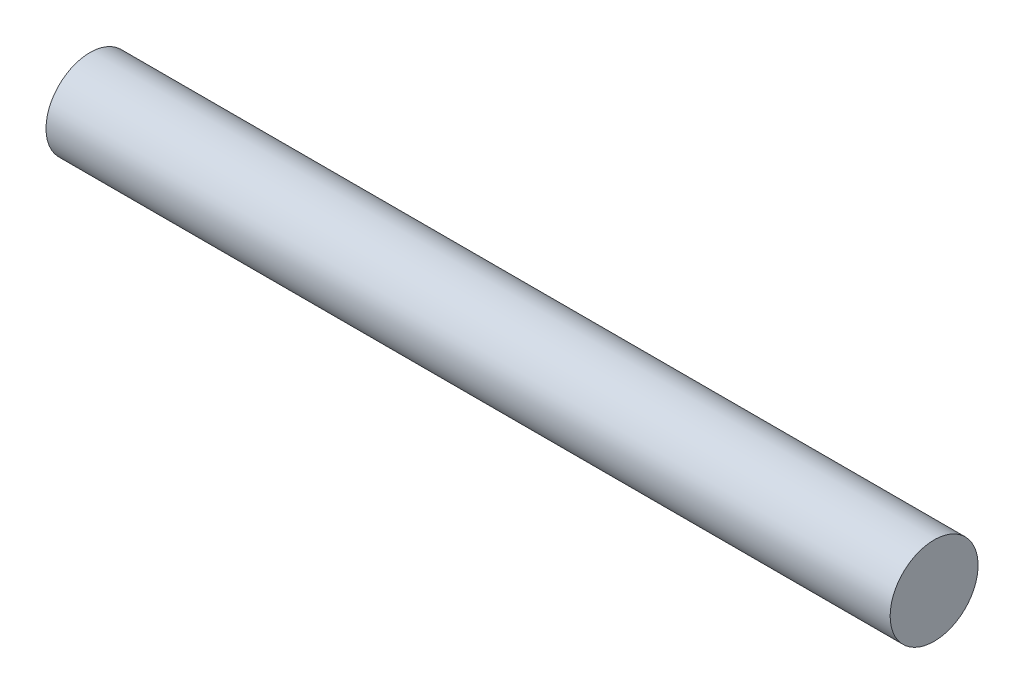
ISO-10303-21;
HEADER;
FILE_DESCRIPTION(('STEP AP214'),'2;1');
FILE_NAME('part.step','',(''),(''),'','','');
FILE_SCHEMA(('AUTOMOTIVE_DESIGN { 1 0 10303 214 1 1 1 1 }'));
ENDSEC;
DATA;
#1=APPLICATION_CONTEXT('core data for automotive mechanical design processes');
#2=APPLICATION_PROTOCOL_DEFINITION('international standard','automotive_design',2000,#1);
#3=PRODUCT_CONTEXT('',#1,'mechanical');
#4=PRODUCT('Part','Part','',(#3));
#5=PRODUCT_RELATED_PRODUCT_CATEGORY('part','',(#4));
#6=PRODUCT_DEFINITION_FORMATION('','',#4);
#7=PRODUCT_DEFINITION_CONTEXT('part definition',#1,'design');
#8=PRODUCT_DEFINITION('design','',#6,#7);
#9=PRODUCT_DEFINITION_SHAPE('','',#8);
#10=(LENGTH_UNIT() NAMED_UNIT(*) SI_UNIT(.MILLI.,.METRE.));
#11=(NAMED_UNIT(*) PLANE_ANGLE_UNIT() SI_UNIT($,.RADIAN.));
#12=(NAMED_UNIT(*) SI_UNIT($,.STERADIAN.) SOLID_ANGLE_UNIT());
#13=UNCERTAINTY_MEASURE_WITH_UNIT(LENGTH_MEASURE(1.E-05),#10,'distance_accuracy_value','');
#14=(GEOMETRIC_REPRESENTATION_CONTEXT(3) GLOBAL_UNCERTAINTY_ASSIGNED_CONTEXT((#13)) GLOBAL_UNIT_ASSIGNED_CONTEXT((#10,
#11,#12)) REPRESENTATION_CONTEXT('',''));
#15=CARTESIAN_POINT('',(0.,0.,0.));
#16=DIRECTION('',(0.,0.,1.));
#17=DIRECTION('',(1.,0.,0.));
#18=AXIS2_PLACEMENT_3D('',#15,#16,#17);
#19=CARTESIAN_POINT('',(76.2,0.,0.));
#20=DIRECTION('',(-1.,0.,0.));
#21=DIRECTION('',(0.,0.,1.));
#22=AXIS2_PLACEMENT_3D('',#19,#20,#21);
#23=CYLINDRICAL_SURFACE('',#22,15.875);
#24=CARTESIAN_POINT('',(0.,0.,0.));
#25=DIRECTION('',(1.,0.,0.));
#26=DIRECTION('',(0.,0.,-1.));
#27=AXIS2_PLACEMENT_3D('',#24,#25,#26);
#28=CIRCLE('',#27,15.875);
#29=CARTESIAN_POINT('',(0.,0.,15.875));
#30=VERTEX_POINT('',#29);
#31=EDGE_CURVE('E12',#30,#30,#28,.T.);
#32=CARTESIAN_POINT('',(304.8,0.,0.));
#33=DIRECTION('',(1.,0.,0.));
#34=DIRECTION('',(0.,0.,-1.));
#35=AXIS2_PLACEMENT_3D('',#32,#33,#34);
#36=CIRCLE('',#35,15.875);
#37=CARTESIAN_POINT('',(304.8,0.,15.875));
#38=VERTEX_POINT('',#37);
#39=EDGE_CURVE('E52',#38,#38,#36,.T.);
#40=CARTESIAN_POINT('',(0.,0.,15.875));
#41=CARTESIAN_POINT('',(3.175,0.,15.875));
#42=CARTESIAN_POINT('',(6.35,0.,15.875));
#43=CARTESIAN_POINT('',(12.7,0.,15.875));
#44=CARTESIAN_POINT('',(15.875,0.,15.875));
#45=CARTESIAN_POINT('',(22.225,0.,15.875));
#46=CARTESIAN_POINT('',(25.4,0.,15.875));
#47=CARTESIAN_POINT('',(31.75,0.,15.875));
#48=CARTESIAN_POINT('',(34.925,0.,15.875));
#49=CARTESIAN_POINT('',(41.275,0.,15.875));
#50=CARTESIAN_POINT('',(44.45,0.,15.875));
#51=CARTESIAN_POINT('',(50.8,0.,15.875));
#52=CARTESIAN_POINT('',(53.975,0.,15.875));
#53=CARTESIAN_POINT('',(60.325,0.,15.875));
#54=CARTESIAN_POINT('',(63.5,0.,15.875));
#55=CARTESIAN_POINT('',(69.85,0.,15.875));
#56=CARTESIAN_POINT('',(73.025,0.,15.875));
#57=CARTESIAN_POINT('',(79.375,0.,15.875));
#58=CARTESIAN_POINT('',(82.55,0.,15.875));
#59=CARTESIAN_POINT('',(88.9,0.,15.875));
#60=CARTESIAN_POINT('',(92.075,0.,15.875));
#61=CARTESIAN_POINT('',(98.425,0.,15.875));
#62=CARTESIAN_POINT('',(101.6,0.,15.875));
#63=CARTESIAN_POINT('',(107.95,0.,15.875));
#64=CARTESIAN_POINT('',(111.125,0.,15.875));
#65=CARTESIAN_POINT('',(117.475,0.,15.875));
#66=CARTESIAN_POINT('',(120.65,0.,15.875));
#67=CARTESIAN_POINT('',(127.,0.,15.875));
#68=CARTESIAN_POINT('',(130.175,0.,15.875));
#69=CARTESIAN_POINT('',(136.525,0.,15.875));
#70=CARTESIAN_POINT('',(139.7,0.,15.875));
#71=CARTESIAN_POINT('',(146.05,0.,15.875));
#72=CARTESIAN_POINT('',(149.225,0.,15.875));
#73=CARTESIAN_POINT('',(155.575,0.,15.875));
#74=CARTESIAN_POINT('',(158.75,0.,15.875));
#75=CARTESIAN_POINT('',(165.1,0.,15.875));
#76=CARTESIAN_POINT('',(168.275,0.,15.875));
#77=CARTESIAN_POINT('',(174.625,0.,15.875));
#78=CARTESIAN_POINT('',(177.8,0.,15.875));
#79=CARTESIAN_POINT('',(184.15,0.,15.875));
#80=CARTESIAN_POINT('',(187.325,0.,15.875));
#81=CARTESIAN_POINT('',(193.675,0.,15.875));
#82=CARTESIAN_POINT('',(196.85,0.,15.875));
#83=CARTESIAN_POINT('',(203.2,0.,15.875));
#84=CARTESIAN_POINT('',(206.375,0.,15.875));
#85=CARTESIAN_POINT('',(212.725,0.,15.875));
#86=CARTESIAN_POINT('',(215.9,0.,15.875));
#87=CARTESIAN_POINT('',(222.25,0.,15.875));
#88=CARTESIAN_POINT('',(225.425,0.,15.875));
#89=CARTESIAN_POINT('',(231.775,0.,15.875));
#90=CARTESIAN_POINT('',(234.95,0.,15.875));
#91=CARTESIAN_POINT('',(241.3,0.,15.875));
#92=CARTESIAN_POINT('',(244.475,0.,15.875));
#93=CARTESIAN_POINT('',(250.825,0.,15.875));
#94=CARTESIAN_POINT('',(254.,0.,15.875));
#95=CARTESIAN_POINT('',(260.35,0.,15.875));
#96=CARTESIAN_POINT('',(263.525,0.,15.875));
#97=CARTESIAN_POINT('',(269.875,0.,15.875));
#98=CARTESIAN_POINT('',(273.05,0.,15.875));
#99=CARTESIAN_POINT('',(279.4,0.,15.875));
#100=CARTESIAN_POINT('',(282.575,0.,15.875));
#101=CARTESIAN_POINT('',(288.925,0.,15.875));
#102=CARTESIAN_POINT('',(292.1,0.,15.875));
#103=CARTESIAN_POINT('',(298.45,0.,15.875));
#104=CARTESIAN_POINT('',(301.625,0.,15.875));
#105=CARTESIAN_POINT('',(304.8,0.,15.875));
#106=B_SPLINE_CURVE_WITH_KNOTS('',3,(#40,#41,#42,#43,#44,#45,#46,#47,#48,#49,#50,#51,#52,#53,
#54,#55,#56,#57,#58,#59,#60,#61,#62,#63,#64,#65,#66,#67,#68,#69,#70,#71,#72,#73,#74,#75,#76,#77,
#78,#79,#80,#81,#82,#83,#84,#85,#86,#87,#88,#89,#90,#91,#92,#93,#94,#95,#96,#97,#98,#99,#100,
#101,#102,#103,#104,#105),.UNSPECIFIED.,.F.,.F.,(4,2,2,2,2,2,2,2,2,2,2,2,2,2,2,2,2,2,2,2,2,2,2,
2,2,2,2,2,2,2,2,2,4),(0.,9.52500000000001,19.05,28.575,38.1,47.625,57.15,66.675,76.2,85.725,
95.25,104.775,114.3,123.825,133.35,142.875,152.4,161.925,171.45,180.975,190.5,200.025,209.55,
219.075,228.6,238.125,247.65,257.175,266.7,276.225,285.75,295.275,304.8),.UNSPECIFIED.);
#107=EDGE_CURVE('BSEAM46',#30,#38,#106,.T.);
#108=ORIENTED_EDGE('',*,*,#31,.T.);
#109=ORIENTED_EDGE('',*,*,#39,.F.);
#110=ORIENTED_EDGE('',*,*,#107,.T.);
#111=ORIENTED_EDGE('',*,*,#107,.F.);
#112=EDGE_LOOP('',(#108,#110,#109,#111));
#113=FACE_BOUND('',#112,.T.);
#114=ADVANCED_FACE('F46',(#113),#23,.T.);
#115=CARTESIAN_POINT('',(0.,0.,0.));
#116=DIRECTION('',(1.,0.,0.));
#117=DIRECTION('',(0.,0.,-1.));
#118=AXIS2_PLACEMENT_3D('',#115,#116,#117);
#119=PLANE('',#118);
#120=ORIENTED_EDGE('',*,*,#31,.F.);
#121=EDGE_LOOP('',(#120));
#122=FACE_BOUND('',#121,.T.);
#123=ADVANCED_FACE('F61',(#122),#119,.F.);
#124=CARTESIAN_POINT('',(304.8,0.,0.));
#125=DIRECTION('',(1.,0.,0.));
#126=DIRECTION('',(0.,0.,-1.));
#127=AXIS2_PLACEMENT_3D('',#124,#125,#126);
#128=PLANE('',#127);
#129=ORIENTED_EDGE('',*,*,#39,.T.);
#130=EDGE_LOOP('',(#129));
#131=FACE_BOUND('',#130,.T.);
#132=ADVANCED_FACE('F58',(#131),#128,.T.);
#133=CLOSED_SHELL('',(#114,#123,#132));
#134=MANIFOLD_SOLID_BREP('B2',#133);
#135=ADVANCED_BREP_SHAPE_REPRESENTATION('',(#18,#134),#14);
#136=SHAPE_DEFINITION_REPRESENTATION(#9,#135);
ENDSEC;
END-ISO-10303-21;
